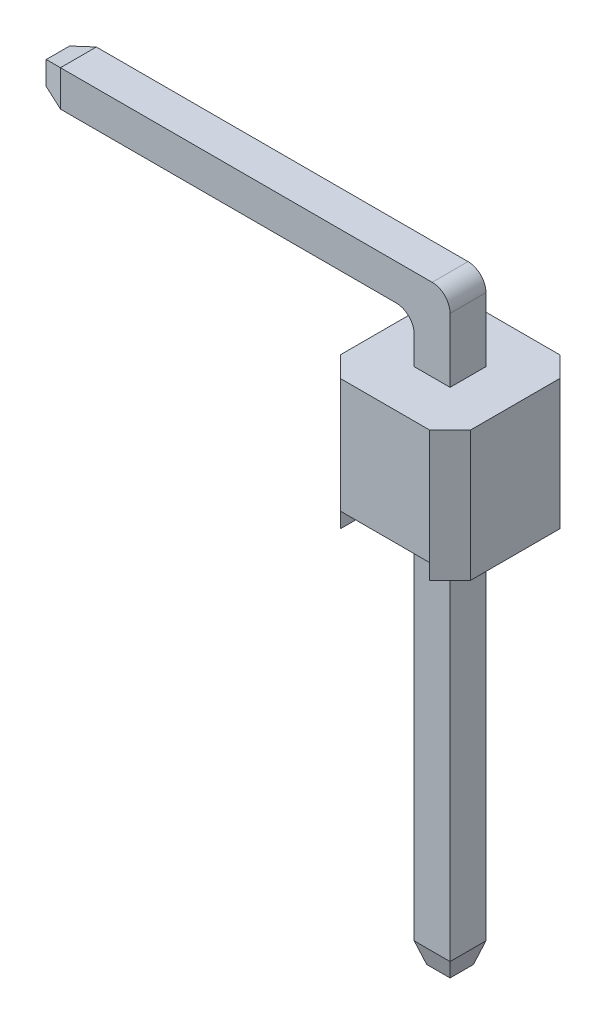
ISO-10303-21;
HEADER;
FILE_DESCRIPTION(('STEP AP214'),'2;1');
FILE_NAME('part.step','',(''),(''),'','','');
FILE_SCHEMA(('AUTOMOTIVE_DESIGN { 1 0 10303 214 1 1 1 1 }'));
ENDSEC;
DATA;
#1=APPLICATION_CONTEXT('core data for automotive mechanical design processes');
#2=APPLICATION_PROTOCOL_DEFINITION('international standard','automotive_design',2000,#1);
#3=PRODUCT_CONTEXT('',#1,'mechanical');
#4=PRODUCT('Part','Part','',(#3));
#5=PRODUCT_RELATED_PRODUCT_CATEGORY('part','',(#4));
#6=PRODUCT_DEFINITION_FORMATION('','',#4);
#7=PRODUCT_DEFINITION_CONTEXT('part definition',#1,'design');
#8=PRODUCT_DEFINITION('design','',#6,#7);
#9=PRODUCT_DEFINITION_SHAPE('','',#8);
#10=(LENGTH_UNIT() NAMED_UNIT(*) SI_UNIT(.MILLI.,.METRE.));
#11=(NAMED_UNIT(*) PLANE_ANGLE_UNIT() SI_UNIT($,.RADIAN.));
#12=(NAMED_UNIT(*) SI_UNIT($,.STERADIAN.) SOLID_ANGLE_UNIT());
#13=UNCERTAINTY_MEASURE_WITH_UNIT(LENGTH_MEASURE(1.E-05),#10,'distance_accuracy_value','');
#14=(GEOMETRIC_REPRESENTATION_CONTEXT(3) GLOBAL_UNCERTAINTY_ASSIGNED_CONTEXT((#13)) GLOBAL_UNIT_ASSIGNED_CONTEXT((#10,
#11,#12)) REPRESENTATION_CONTEXT('',''));
#15=CARTESIAN_POINT('',(0.,0.,0.));
#16=DIRECTION('',(0.,0.,1.));
#17=DIRECTION('',(1.,0.,0.));
#18=AXIS2_PLACEMENT_3D('',#15,#16,#17);
#19=CARTESIAN_POINT('',(0.,0.3,0.));
#20=DIRECTION('',(0.,-1.,0.));
#21=DIRECTION('',(0.,0.,-1.));
#22=AXIS2_PLACEMENT_3D('',#19,#20,#21);
#23=PLANE('',#22);
#24=DIRECTION('',(0.,0.,-1.));
#25=VECTOR('',#24,1.);
#26=CARTESIAN_POINT('',(-0.870000000000001,0.3,1.27));
#27=LINE('',#26,#25);
#28=CARTESIAN_POINT('',(-0.870000000000001,0.3,1.27));
#29=VERTEX_POINT('',#28);
#30=CARTESIAN_POINT('',(-0.870000000000001,0.3,-1.27));
#31=VERTEX_POINT('',#30);
#32=EDGE_CURVE('E275',#29,#31,#27,.T.);
#33=ORIENTED_EDGE('',*,*,#32,.T.);
#34=DIRECTION('',(1.,0.,0.));
#35=VECTOR('',#34,1.);
#36=CARTESIAN_POINT('',(-0.870000000000001,0.3,-1.27));
#37=LINE('',#36,#35);
#38=CARTESIAN_POINT('',(0.869999999999999,0.3,-1.27));
#39=VERTEX_POINT('',#38);
#40=EDGE_CURVE('E278',#31,#39,#37,.T.);
#41=ORIENTED_EDGE('',*,*,#40,.T.);
#42=DIRECTION('',(0.,0.,1.));
#43=VECTOR('',#42,1.);
#44=CARTESIAN_POINT('',(0.869999999999999,0.3,1.27));
#45=LINE('',#44,#43);
#46=CARTESIAN_POINT('',(0.869999999999999,0.3,1.27));
#47=VERTEX_POINT('',#46);
#48=EDGE_CURVE('E282',#39,#47,#45,.T.);
#49=ORIENTED_EDGE('',*,*,#48,.T.);
#50=DIRECTION('',(-1.,0.,0.));
#51=VECTOR('',#50,1.);
#52=CARTESIAN_POINT('',(-0.870000000000001,0.3,1.27));
#53=LINE('',#52,#51);
#54=EDGE_CURVE('E285',#47,#29,#53,.T.);
#55=ORIENTED_EDGE('',*,*,#54,.T.);
#56=EDGE_LOOP('',(#33,#41,#49,#55));
#57=FACE_BOUND('',#56,.T.);
#58=DIRECTION('',(1.,0.,0.));
#59=VECTOR('',#58,1.);
#60=CARTESIAN_POINT('',(0.35,0.3,-0.35));
#61=LINE('',#60,#59);
#62=CARTESIAN_POINT('',(-0.35,0.3,-0.35));
#63=VERTEX_POINT('',#62);
#64=CARTESIAN_POINT('',(0.35,0.3,-0.35));
#65=VERTEX_POINT('',#64);
#66=EDGE_CURVE('E233',#63,#65,#61,.T.);
#67=ORIENTED_EDGE('',*,*,#66,.F.);
#68=DIRECTION('',(0.,0.,-1.));
#69=VECTOR('',#68,1.);
#70=CARTESIAN_POINT('',(-0.35,0.3,0.35));
#71=LINE('',#70,#69);
#72=CARTESIAN_POINT('',(-0.35,0.3,0.35));
#73=VERTEX_POINT('',#72);
#74=EDGE_CURVE('E214',#73,#63,#71,.T.);
#75=ORIENTED_EDGE('',*,*,#74,.F.);
#76=DIRECTION('',(-1.,0.,0.));
#77=VECTOR('',#76,1.);
#78=CARTESIAN_POINT('',(0.35,0.3,0.35));
#79=LINE('',#78,#77);
#80=CARTESIAN_POINT('',(0.35,0.3,0.35));
#81=VERTEX_POINT('',#80);
#82=EDGE_CURVE('E223',#81,#73,#79,.T.);
#83=ORIENTED_EDGE('',*,*,#82,.F.);
#84=DIRECTION('',(0.,0.,1.));
#85=VECTOR('',#84,1.);
#86=CARTESIAN_POINT('',(0.35,0.3,0.35));
#87=LINE('',#86,#85);
#88=EDGE_CURVE('E242',#65,#81,#87,.T.);
#89=ORIENTED_EDGE('',*,*,#88,.F.);
#90=EDGE_LOOP('',(#67,#75,#83,#89));
#91=FACE_BOUND('',#90,.T.);
#92=ADVANCED_FACE('F37',(#57,#91),#23,.T.);
#93=CARTESIAN_POINT('',(-0.35,4.14,-0.35));
#94=DIRECTION('',(1.,0.,0.));
#95=DIRECTION('',(0.,0.,-1.));
#96=AXIS2_PLACEMENT_3D('',#93,#94,#95);
#97=PLANE('',#96);
#98=DIRECTION('',(0.,-1.,0.));
#99=VECTOR('',#98,1.);
#100=CARTESIAN_POINT('',(-0.35,4.14,0.35));
#101=LINE('',#100,#99);
#102=CARTESIAN_POINT('',(-0.35,3.09,0.35));
#103=VERTEX_POINT('',#102);
#104=CARTESIAN_POINT('',(-0.35,2.54,0.35));
#105=VERTEX_POINT('',#104);
#106=EDGE_CURVE('E272',#103,#105,#101,.T.);
#107=ORIENTED_EDGE('',*,*,#106,.F.);
#108=DIRECTION('',(0.,0.,1.));
#109=VECTOR('',#108,1.);
#110=CARTESIAN_POINT('',(-0.35,3.09,-0.35));
#111=LINE('',#110,#109);
#112=CARTESIAN_POINT('',(-0.35,3.09,-0.35));
#113=VERTEX_POINT('',#112);
#114=EDGE_CURVE('E410',#103,#113,#111,.F.);
#115=ORIENTED_EDGE('',*,*,#114,.T.);
#116=DIRECTION('',(0.,-1.,0.));
#117=VECTOR('',#116,1.);
#118=CARTESIAN_POINT('',(-0.35,4.14,-0.35));
#119=LINE('',#118,#117);
#120=CARTESIAN_POINT('',(-0.35,2.54,-0.35));
#121=VERTEX_POINT('',#120);
#122=EDGE_CURVE('E256',#113,#121,#119,.T.);
#123=ORIENTED_EDGE('',*,*,#122,.T.);
#124=DIRECTION('',(0.,0.,1.));
#125=VECTOR('',#124,1.);
#126=CARTESIAN_POINT('',(-0.35,2.54,-0.35));
#127=LINE('',#126,#125);
#128=EDGE_CURVE('E249',#121,#105,#127,.T.);
#129=ORIENTED_EDGE('',*,*,#128,.T.);
#130=EDGE_LOOP('',(#107,#115,#123,#129));
#131=FACE_BOUND('',#130,.T.);
#132=ADVANCED_FACE('F426',(#131),#97,.F.);
#133=CARTESIAN_POINT('',(0.,2.54,0.));
#134=DIRECTION('',(0.,1.,0.));
#135=DIRECTION('',(0.,0.,1.));
#136=AXIS2_PLACEMENT_3D('',#133,#134,#135);
#137=PLANE('',#136);
#138=DIRECTION('',(-1.,0.,0.));
#139=VECTOR('',#138,1.);
#140=CARTESIAN_POINT('',(-1.27,2.54,-1.27));
#141=LINE('',#140,#139);
#142=CARTESIAN_POINT('',(0.869999999999999,2.54,-1.27));
#143=VERTEX_POINT('',#142);
#144=CARTESIAN_POINT('',(-0.869999999999999,2.54,-1.27));
#145=VERTEX_POINT('',#144);
#146=EDGE_CURVE('E298',#143,#145,#141,.T.);
#147=ORIENTED_EDGE('',*,*,#146,.T.);
#148=DIRECTION('',(0.707106781186548,0.,-0.707106781186547));
#149=VECTOR('',#148,1.);
#150=CARTESIAN_POINT('',(-1.07,2.54,-1.07));
#151=LINE('',#150,#149);
#152=CARTESIAN_POINT('',(-1.27,2.54,-0.869999999999999));
#153=VERTEX_POINT('',#152);
#154=EDGE_CURVE('E339',#145,#153,#151,.F.);
#155=ORIENTED_EDGE('',*,*,#154,.T.);
#156=DIRECTION('',(0.,0.,1.));
#157=VECTOR('',#156,1.);
#158=CARTESIAN_POINT('',(-1.27,2.54,-1.27));
#159=LINE('',#158,#157);
#160=CARTESIAN_POINT('',(-1.27,2.54,0.869999999999999));
#161=VERTEX_POINT('',#160);
#162=EDGE_CURVE('E302',#153,#161,#159,.T.);
#163=ORIENTED_EDGE('',*,*,#162,.T.);
#164=DIRECTION('',(-0.707106781186546,0.,-0.707106781186549));
#165=VECTOR('',#164,1.);
#166=CARTESIAN_POINT('',(-1.07,2.54,1.07));
#167=LINE('',#166,#165);
#168=CARTESIAN_POINT('',(-0.87,2.54,1.27));
#169=VERTEX_POINT('',#168);
#170=EDGE_CURVE('E335',#161,#169,#167,.F.);
#171=ORIENTED_EDGE('',*,*,#170,.T.);
#172=DIRECTION('',(1.,0.,0.));
#173=VECTOR('',#172,1.);
#174=CARTESIAN_POINT('',(-1.27,2.54,1.27));
#175=LINE('',#174,#173);
#176=CARTESIAN_POINT('',(0.869999999999998,2.54,1.27));
#177=VERTEX_POINT('',#176);
#178=EDGE_CURVE('E305',#169,#177,#175,.T.);
#179=ORIENTED_EDGE('',*,*,#178,.T.);
#180=DIRECTION('',(-0.707106781186549,0.,0.707106781186546));
#181=VECTOR('',#180,1.);
#182=CARTESIAN_POINT('',(1.07,2.54,1.07));
#183=LINE('',#182,#181);
#184=CARTESIAN_POINT('',(1.27,2.54,0.869999999999999));
#185=VERTEX_POINT('',#184);
#186=EDGE_CURVE('E333',#177,#185,#183,.F.);
#187=ORIENTED_EDGE('',*,*,#186,.T.);
#188=DIRECTION('',(0.,0.,-1.));
#189=VECTOR('',#188,1.);
#190=CARTESIAN_POINT('',(1.27,2.54,-1.27));
#191=LINE('',#190,#189);
#192=CARTESIAN_POINT('',(1.27,2.54,-0.869999999999999));
#193=VERTEX_POINT('',#192);
#194=EDGE_CURVE('E295',#185,#193,#191,.T.);
#195=ORIENTED_EDGE('',*,*,#194,.T.);
#196=DIRECTION('',(0.707106781186547,0.,0.707106781186548));
#197=VECTOR('',#196,1.);
#198=CARTESIAN_POINT('',(1.07,2.54,-1.07));
#199=LINE('',#198,#197);
#200=EDGE_CURVE('E337',#193,#143,#199,.F.);
#201=ORIENTED_EDGE('',*,*,#200,.T.);
#202=EDGE_LOOP('',(#147,#155,#163,#171,#179,#187,#195,#201));
#203=FACE_BOUND('',#202,.T.);
#204=DIRECTION('',(1.,0.,0.));
#205=VECTOR('',#204,1.);
#206=CARTESIAN_POINT('',(0.35,2.54,0.35));
#207=LINE('',#206,#205);
#208=CARTESIAN_POINT('',(0.35,2.54,0.35));
#209=VERTEX_POINT('',#208);
#210=EDGE_CURVE('E259',#105,#209,#207,.T.);
#211=ORIENTED_EDGE('',*,*,#210,.F.);
#212=ORIENTED_EDGE('',*,*,#128,.F.);
#213=DIRECTION('',(-1.,0.,0.));
#214=VECTOR('',#213,1.);
#215=CARTESIAN_POINT('',(0.35,2.54,-0.35));
#216=LINE('',#215,#214);
#217=CARTESIAN_POINT('',(0.35,2.54,-0.35));
#218=VERTEX_POINT('',#217);
#219=EDGE_CURVE('E254',#218,#121,#216,.T.);
#220=ORIENTED_EDGE('',*,*,#219,.F.);
#221=DIRECTION('',(0.,0.,-1.));
#222=VECTOR('',#221,1.);
#223=CARTESIAN_POINT('',(0.35,2.54,-0.35));
#224=LINE('',#223,#222);
#225=EDGE_CURVE('E262',#209,#218,#224,.T.);
#226=ORIENTED_EDGE('',*,*,#225,.F.);
#227=EDGE_LOOP('',(#211,#212,#220,#226));
#228=FACE_BOUND('',#227,.T.);
#229=ADVANCED_FACE('F475',(#203,#228),#137,.T.);
#230=CARTESIAN_POINT('',(-1.27,2.54,-1.27));
#231=DIRECTION('',(0.,0.,1.));
#232=DIRECTION('',(1.,0.,0.));
#233=AXIS2_PLACEMENT_3D('',#230,#231,#232);
#234=PLANE('',#233);
#235=ORIENTED_EDGE('',*,*,#40,.F.);
#236=DIRECTION('',(0.,1.,0.));
#237=VECTOR('',#236,1.);
#238=CARTESIAN_POINT('',(-0.869999999999999,2.54,-1.27));
#239=LINE('',#238,#237);
#240=EDGE_CURVE('E330',#31,#145,#239,.T.);
#241=ORIENTED_EDGE('',*,*,#240,.T.);
#242=ORIENTED_EDGE('',*,*,#146,.F.);
#243=DIRECTION('',(0.,-1.,0.));
#244=VECTOR('',#243,1.);
#245=CARTESIAN_POINT('',(0.869999999999999,2.54,-1.27));
#246=LINE('',#245,#244);
#247=EDGE_CURVE('E327',#143,#39,#246,.T.);
#248=ORIENTED_EDGE('',*,*,#247,.T.);
#249=EDGE_LOOP('',(#235,#241,#242,#248));
#250=FACE_BOUND('',#249,.T.);
#251=ADVANCED_FACE('F490',(#250),#234,.F.);
#252=CARTESIAN_POINT('',(-1.27,2.54,1.27));
#253=DIRECTION('',(0.,0.,-1.));
#254=DIRECTION('',(-1.,0.,0.));
#255=AXIS2_PLACEMENT_3D('',#252,#253,#254);
#256=PLANE('',#255);
#257=ORIENTED_EDGE('',*,*,#54,.F.);
#258=DIRECTION('',(0.,1.,0.));
#259=VECTOR('',#258,1.);
#260=CARTESIAN_POINT('',(0.869999999999999,2.54,1.27));
#261=LINE('',#260,#259);
#262=EDGE_CURVE('E346',#47,#177,#261,.T.);
#263=ORIENTED_EDGE('',*,*,#262,.T.);
#264=ORIENTED_EDGE('',*,*,#178,.F.);
#265=DIRECTION('',(0.,-1.,0.));
#266=VECTOR('',#265,1.);
#267=CARTESIAN_POINT('',(-0.87,2.54,1.27));
#268=LINE('',#267,#266);
#269=EDGE_CURVE('E349',#169,#29,#268,.T.);
#270=ORIENTED_EDGE('',*,*,#269,.T.);
#271=EDGE_LOOP('',(#257,#263,#264,#270));
#272=FACE_BOUND('',#271,.T.);
#273=ADVANCED_FACE('F499',(#272),#256,.F.);
#274=CARTESIAN_POINT('',(0.,0.,0.));
#275=DIRECTION('',(0.,1.,0.));
#276=DIRECTION('',(0.,0.,1.));
#277=AXIS2_PLACEMENT_3D('',#274,#275,#276);
#278=PLANE('',#277);
#279=DIRECTION('',(-0.707106781186548,0.,0.707106781186547));
#280=VECTOR('',#279,1.);
#281=CARTESIAN_POINT('',(-1.27,0.,-0.869999999999999));
#282=LINE('',#281,#280);
#283=CARTESIAN_POINT('',(-1.27,0.,-0.869999999999999));
#284=VERTEX_POINT('',#283);
#285=CARTESIAN_POINT('',(-0.870000000000001,0.,-1.27));
#286=VERTEX_POINT('',#285);
#287=EDGE_CURVE('E324',#284,#286,#282,.F.);
#288=ORIENTED_EDGE('',*,*,#287,.T.);
#289=DIRECTION('',(0.,0.,-1.));
#290=VECTOR('',#289,1.);
#291=CARTESIAN_POINT('',(-0.870000000000001,0.,1.27));
#292=LINE('',#291,#290);
#293=CARTESIAN_POINT('',(-0.870000000000001,0.,1.27));
#294=VERTEX_POINT('',#293);
#295=EDGE_CURVE('E274',#294,#286,#292,.T.);
#296=ORIENTED_EDGE('',*,*,#295,.F.);
#297=DIRECTION('',(0.707106781186546,0.,0.707106781186549));
#298=VECTOR('',#297,1.);
#299=CARTESIAN_POINT('',(-0.87,0.,1.27));
#300=LINE('',#299,#298);
#301=CARTESIAN_POINT('',(-1.27,0.,0.869999999999999));
#302=VERTEX_POINT('',#301);
#303=EDGE_CURVE('E320',#294,#302,#300,.F.);
#304=ORIENTED_EDGE('',*,*,#303,.T.);
#305=DIRECTION('',(0.,0.,1.));
#306=VECTOR('',#305,1.);
#307=CARTESIAN_POINT('',(-1.27,0.,-1.27));
#308=LINE('',#307,#306);
#309=EDGE_CURVE('E299',#284,#302,#308,.T.);
#310=ORIENTED_EDGE('',*,*,#309,.F.);
#311=EDGE_LOOP('',(#288,#296,#304,#310));
#312=FACE_BOUND('',#311,.T.);
#313=ADVANCED_FACE('F498',(#312),#278,.F.);
#314=CARTESIAN_POINT('',(1.27,2.54,-1.27));
#315=DIRECTION('',(-1.,0.,0.));
#316=DIRECTION('',(0.,0.,1.));
#317=AXIS2_PLACEMENT_3D('',#314,#315,#316);
#318=PLANE('',#317);
#319=DIRECTION('',(0.,0.,-1.));
#320=VECTOR('',#319,1.);
#321=CARTESIAN_POINT('',(1.27,0.,-1.27));
#322=LINE('',#321,#320);
#323=CARTESIAN_POINT('',(1.27,0.,0.87));
#324=VERTEX_POINT('',#323);
#325=CARTESIAN_POINT('',(1.27,0.,-0.869999999999998));
#326=VERTEX_POINT('',#325);
#327=EDGE_CURVE('E293',#324,#326,#322,.T.);
#328=ORIENTED_EDGE('',*,*,#327,.T.);
#329=DIRECTION('',(0.,1.,0.));
#330=VECTOR('',#329,1.);
#331=CARTESIAN_POINT('',(1.27,2.54,-0.869999999999998));
#332=LINE('',#331,#330);
#333=EDGE_CURVE('E344',#326,#193,#332,.T.);
#334=ORIENTED_EDGE('',*,*,#333,.T.);
#335=ORIENTED_EDGE('',*,*,#194,.F.);
#336=DIRECTION('',(0.,-1.,0.));
#337=VECTOR('',#336,1.);
#338=CARTESIAN_POINT('',(1.27,2.54,0.870000000000001));
#339=LINE('',#338,#337);
#340=EDGE_CURVE('E341',#185,#324,#339,.T.);
#341=ORIENTED_EDGE('',*,*,#340,.T.);
#342=EDGE_LOOP('',(#328,#334,#335,#341));
#343=FACE_BOUND('',#342,.T.);
#344=ADVANCED_FACE('F505',(#343),#318,.F.);
#345=CARTESIAN_POINT('',(-1.27,2.54,-1.27));
#346=DIRECTION('',(1.,0.,0.));
#347=DIRECTION('',(0.,0.,-1.));
#348=AXIS2_PLACEMENT_3D('',#345,#346,#347);
#349=PLANE('',#348);
#350=ORIENTED_EDGE('',*,*,#162,.F.);
#351=DIRECTION('',(0.,-1.,0.));
#352=VECTOR('',#351,1.);
#353=CARTESIAN_POINT('',(-1.27,2.54,-0.869999999999999));
#354=LINE('',#353,#352);
#355=EDGE_CURVE('E314',#153,#284,#354,.T.);
#356=ORIENTED_EDGE('',*,*,#355,.T.);
#357=ORIENTED_EDGE('',*,*,#309,.T.);
#358=DIRECTION('',(0.,1.,0.));
#359=VECTOR('',#358,1.);
#360=CARTESIAN_POINT('',(-1.27,2.54,0.869999999999999));
#361=LINE('',#360,#359);
#362=EDGE_CURVE('E308',#302,#161,#361,.T.);
#363=ORIENTED_EDGE('',*,*,#362,.T.);
#364=EDGE_LOOP('',(#350,#356,#357,#363));
#365=FACE_BOUND('',#364,.T.);
#366=ADVANCED_FACE('F496',(#365),#349,.F.);
#367=DIRECTION('',(0.707106781186549,0.,-0.707106781186546));
#368=VECTOR('',#367,1.);
#369=CARTESIAN_POINT('',(1.27,0.,0.870000000000001));
#370=LINE('',#369,#368);
#371=CARTESIAN_POINT('',(0.869999999999999,0.,1.27));
#372=VERTEX_POINT('',#371);
#373=EDGE_CURVE('E317',#324,#372,#370,.F.);
#374=ORIENTED_EDGE('',*,*,#373,.T.);
#375=DIRECTION('',(0.,0.,1.));
#376=VECTOR('',#375,1.);
#377=CARTESIAN_POINT('',(0.869999999999999,0.,1.27));
#378=LINE('',#377,#376);
#379=CARTESIAN_POINT('',(0.869999999999999,0.,-1.27));
#380=VERTEX_POINT('',#379);
#381=EDGE_CURVE('E279',#380,#372,#378,.T.);
#382=ORIENTED_EDGE('',*,*,#381,.F.);
#383=DIRECTION('',(-0.707106781186547,0.,-0.707106781186548));
#384=VECTOR('',#383,1.);
#385=CARTESIAN_POINT('',(0.869999999999999,0.,-1.27));
#386=LINE('',#385,#384);
#387=EDGE_CURVE('E322',#380,#326,#386,.F.);
#388=ORIENTED_EDGE('',*,*,#387,.T.);
#389=ORIENTED_EDGE('',*,*,#327,.F.);
#390=EDGE_LOOP('',(#374,#382,#388,#389));
#391=FACE_BOUND('',#390,.T.);
#392=ADVANCED_FACE('F492',(#391),#278,.F.);
#393=CARTESIAN_POINT('',(-1.27,2.54,-0.869999999999999));
#394=DIRECTION('',(0.707106781186547,0.,0.707106781186548));
#395=DIRECTION('',(0.,-1.,0.));
#396=AXIS2_PLACEMENT_3D('',#393,#394,#395);
#397=PLANE('',#396);
#398=ORIENTED_EDGE('',*,*,#154,.F.);
#399=ORIENTED_EDGE('',*,*,#240,.F.);
#400=EDGE_CURVE('E331',#286,#31,#239,.T.);
#401=ORIENTED_EDGE('',*,*,#400,.F.);
#402=ORIENTED_EDGE('',*,*,#287,.F.);
#403=ORIENTED_EDGE('',*,*,#355,.F.);
#404=EDGE_LOOP('',(#398,#399,#401,#402,#403));
#405=FACE_BOUND('',#404,.T.);
#406=ADVANCED_FACE('F495',(#405),#397,.F.);
#407=CARTESIAN_POINT('',(0.869999999999999,2.54,-1.27));
#408=DIRECTION('',(-0.707106781186548,0.,0.707106781186547));
#409=DIRECTION('',(0.,-1.,0.));
#410=AXIS2_PLACEMENT_3D('',#407,#408,#409);
#411=PLANE('',#410);
#412=ORIENTED_EDGE('',*,*,#200,.F.);
#413=ORIENTED_EDGE('',*,*,#333,.F.);
#414=ORIENTED_EDGE('',*,*,#387,.F.);
#415=DIRECTION('',(0.,-1.,0.));
#416=VECTOR('',#415,1.);
#417=CARTESIAN_POINT('',(0.869999999999999,0.3,-1.27));
#418=LINE('',#417,#416);
#419=EDGE_CURVE('E288',#39,#380,#418,.T.);
#420=ORIENTED_EDGE('',*,*,#419,.F.);
#421=ORIENTED_EDGE('',*,*,#247,.F.);
#422=EDGE_LOOP('',(#412,#413,#414,#420,#421));
#423=FACE_BOUND('',#422,.T.);
#424=ADVANCED_FACE('F515',(#423),#411,.F.);
#425=CARTESIAN_POINT('',(-0.87,2.54,1.27));
#426=DIRECTION('',(0.707106781186549,0.,-0.707106781186546));
#427=DIRECTION('',(0.,-1.,0.));
#428=AXIS2_PLACEMENT_3D('',#425,#426,#427);
#429=PLANE('',#428);
#430=ORIENTED_EDGE('',*,*,#170,.F.);
#431=ORIENTED_EDGE('',*,*,#362,.F.);
#432=ORIENTED_EDGE('',*,*,#303,.F.);
#433=DIRECTION('',(0.,-1.,0.));
#434=VECTOR('',#433,1.);
#435=CARTESIAN_POINT('',(-0.870000000000001,0.3,1.27));
#436=LINE('',#435,#434);
#437=EDGE_CURVE('E291',#29,#294,#436,.T.);
#438=ORIENTED_EDGE('',*,*,#437,.F.);
#439=ORIENTED_EDGE('',*,*,#269,.F.);
#440=EDGE_LOOP('',(#430,#431,#432,#438,#439));
#441=FACE_BOUND('',#440,.T.);
#442=ADVANCED_FACE('F519',(#441),#429,.F.);
#443=CARTESIAN_POINT('',(1.27,2.54,0.870000000000001));
#444=DIRECTION('',(-0.707106781186546,0.,-0.707106781186549));
#445=DIRECTION('',(0.,-1.,0.));
#446=AXIS2_PLACEMENT_3D('',#443,#444,#445);
#447=PLANE('',#446);
#448=ORIENTED_EDGE('',*,*,#186,.F.);
#449=ORIENTED_EDGE('',*,*,#262,.F.);
#450=EDGE_CURVE('E347',#372,#47,#261,.T.);
#451=ORIENTED_EDGE('',*,*,#450,.F.);
#452=ORIENTED_EDGE('',*,*,#373,.F.);
#453=ORIENTED_EDGE('',*,*,#340,.F.);
#454=EDGE_LOOP('',(#448,#449,#451,#452,#453));
#455=FACE_BOUND('',#454,.T.);
#456=ADVANCED_FACE('F486',(#455),#447,.F.);
#457=CARTESIAN_POINT('',(-0.870000000000001,0.3,1.27));
#458=DIRECTION('',(-1.,0.,0.));
#459=DIRECTION('',(0.,0.,1.));
#460=AXIS2_PLACEMENT_3D('',#457,#458,#459);
#461=PLANE('',#460);
#462=ORIENTED_EDGE('',*,*,#295,.T.);
#463=ORIENTED_EDGE('',*,*,#400,.T.);
#464=ORIENTED_EDGE('',*,*,#32,.F.);
#465=ORIENTED_EDGE('',*,*,#437,.T.);
#466=EDGE_LOOP('',(#462,#463,#464,#465));
#467=FACE_BOUND('',#466,.T.);
#468=ADVANCED_FACE('F482',(#467),#461,.F.);
#469=CARTESIAN_POINT('',(0.869999999999999,0.3,1.27));
#470=DIRECTION('',(1.,0.,0.));
#471=DIRECTION('',(0.,0.,-1.));
#472=AXIS2_PLACEMENT_3D('',#469,#470,#471);
#473=PLANE('',#472);
#474=ORIENTED_EDGE('',*,*,#381,.T.);
#475=ORIENTED_EDGE('',*,*,#450,.T.);
#476=ORIENTED_EDGE('',*,*,#48,.F.);
#477=ORIENTED_EDGE('',*,*,#419,.T.);
#478=EDGE_LOOP('',(#474,#475,#476,#477));
#479=FACE_BOUND('',#478,.T.);
#480=ADVANCED_FACE('F479',(#479),#473,.F.);
#481=CARTESIAN_POINT('',(0.35,4.14,0.35));
#482=DIRECTION('',(0.,0.,-1.));
#483=DIRECTION('',(-1.,0.,0.));
#484=AXIS2_PLACEMENT_3D('',#481,#482,#483);
#485=PLANE('',#484);
#486=DIRECTION('',(0.,-1.,0.));
#487=VECTOR('',#486,1.);
#488=CARTESIAN_POINT('',(0.35,4.14,0.35));
#489=LINE('',#488,#487);
#490=CARTESIAN_POINT('',(0.35,3.79,0.35));
#491=VERTEX_POINT('',#490);
#492=EDGE_CURVE('E270',#491,#209,#489,.T.);
#493=ORIENTED_EDGE('',*,*,#492,.F.);
#494=CARTESIAN_POINT('',(0.,3.79,0.35));
#495=DIRECTION('',(0.,0.,-1.));
#496=DIRECTION('',(-1.,0.,0.));
#497=AXIS2_PLACEMENT_3D('',#494,#495,#496);
#498=CIRCLE('',#497,0.35);
#499=CARTESIAN_POINT('',(0.,4.14,0.35));
#500=VERTEX_POINT('',#499);
#501=EDGE_CURVE('E417',#491,#500,#498,.F.);
#502=ORIENTED_EDGE('',*,*,#501,.T.);
#503=DIRECTION('',(1.,0.,0.));
#504=VECTOR('',#503,1.);
#505=CARTESIAN_POINT('',(0.35,4.14,0.35));
#506=LINE('',#505,#504);
#507=CARTESIAN_POINT('',(-7.24999999999999,4.14,0.350000000000002));
#508=VERTEX_POINT('',#507);
#509=EDGE_CURVE('E250',#508,#500,#506,.T.);
#510=ORIENTED_EDGE('',*,*,#509,.F.);
#511=DIRECTION('',(0.,-1.,0.));
#512=VECTOR('',#511,1.);
#513=CARTESIAN_POINT('',(-7.24999999999999,3.44,0.350000000000002));
#514=LINE('',#513,#512);
#515=CARTESIAN_POINT('',(-7.24999999999999,3.44,0.350000000000001));
#516=VERTEX_POINT('',#515);
#517=EDGE_CURVE('E364',#508,#516,#514,.T.);
#518=ORIENTED_EDGE('',*,*,#517,.T.);
#519=DIRECTION('',(1.,0.,0.));
#520=VECTOR('',#519,1.);
#521=CARTESIAN_POINT('',(-7.65,3.44,0.350000000000001));
#522=LINE('',#521,#520);
#523=CARTESIAN_POINT('',(-0.7,3.44,0.35));
#524=VERTEX_POINT('',#523);
#525=EDGE_CURVE('E230',#516,#524,#522,.T.);
#526=ORIENTED_EDGE('',*,*,#525,.T.);
#527=CARTESIAN_POINT('',(-0.7,3.09,0.35));
#528=DIRECTION('',(0.,0.,-1.));
#529=DIRECTION('',(-1.,0.,0.));
#530=AXIS2_PLACEMENT_3D('',#527,#528,#529);
#531=CIRCLE('',#530,0.35);
#532=EDGE_CURVE('E45',#524,#103,#531,.T.);
#533=ORIENTED_EDGE('',*,*,#532,.T.);
#534=ORIENTED_EDGE('',*,*,#106,.T.);
#535=ORIENTED_EDGE('',*,*,#210,.T.);
#536=EDGE_LOOP('',(#493,#502,#510,#518,#526,#533,#534,#535));
#537=FACE_BOUND('',#536,.T.);
#538=ADVANCED_FACE('F420',(#537),#485,.F.);
#539=CARTESIAN_POINT('',(0.35,4.14,-0.35));
#540=DIRECTION('',(-1.,0.,0.));
#541=DIRECTION('',(0.,0.,1.));
#542=AXIS2_PLACEMENT_3D('',#539,#540,#541);
#543=PLANE('',#542);
#544=DIRECTION('',(0.,-1.,0.));
#545=VECTOR('',#544,1.);
#546=CARTESIAN_POINT('',(0.35,4.14,-0.35));
#547=LINE('',#546,#545);
#548=CARTESIAN_POINT('',(0.35,3.79,-0.35));
#549=VERTEX_POINT('',#548);
#550=EDGE_CURVE('E268',#549,#218,#547,.T.);
#551=ORIENTED_EDGE('',*,*,#550,.F.);
#552=DIRECTION('',(0.,0.,-1.));
#553=VECTOR('',#552,1.);
#554=CARTESIAN_POINT('',(0.35,3.79,-0.35));
#555=LINE('',#554,#553);
#556=EDGE_CURVE('E52',#549,#491,#555,.F.);
#557=ORIENTED_EDGE('',*,*,#556,.T.);
#558=ORIENTED_EDGE('',*,*,#492,.T.);
#559=ORIENTED_EDGE('',*,*,#225,.T.);
#560=EDGE_LOOP('',(#551,#557,#558,#559));
#561=FACE_BOUND('',#560,.T.);
#562=ADVANCED_FACE('F588',(#561),#543,.F.);
#563=CARTESIAN_POINT('',(0.35,4.14,-0.35));
#564=DIRECTION('',(0.,0.,1.));
#565=DIRECTION('',(1.,0.,0.));
#566=AXIS2_PLACEMENT_3D('',#563,#564,#565);
#567=PLANE('',#566);
#568=DIRECTION('',(-1.,0.,0.));
#569=VECTOR('',#568,1.);
#570=CARTESIAN_POINT('',(0.35,4.14,-0.35));
#571=LINE('',#570,#569);
#572=CARTESIAN_POINT('',(0.,4.14,-0.35));
#573=VERTEX_POINT('',#572);
#574=CARTESIAN_POINT('',(-7.24999999999999,4.14,-0.35));
#575=VERTEX_POINT('',#574);
#576=EDGE_CURVE('E253',#573,#575,#571,.T.);
#577=ORIENTED_EDGE('',*,*,#576,.F.);
#578=CARTESIAN_POINT('',(0.,3.79,-0.35));
#579=DIRECTION('',(0.,0.,1.));
#580=DIRECTION('',(1.,0.,0.));
#581=AXIS2_PLACEMENT_3D('',#578,#579,#580);
#582=CIRCLE('',#581,0.35);
#583=EDGE_CURVE('E60',#573,#549,#582,.F.);
#584=ORIENTED_EDGE('',*,*,#583,.T.);
#585=ORIENTED_EDGE('',*,*,#550,.T.);
#586=ORIENTED_EDGE('',*,*,#219,.T.);
#587=ORIENTED_EDGE('',*,*,#122,.F.);
#588=CARTESIAN_POINT('',(-0.7,3.09,-0.35));
#589=DIRECTION('',(0.,0.,1.));
#590=DIRECTION('',(1.,0.,0.));
#591=AXIS2_PLACEMENT_3D('',#588,#589,#590);
#592=CIRCLE('',#591,0.35);
#593=CARTESIAN_POINT('',(-0.7,3.44,-0.35));
#594=VERTEX_POINT('',#593);
#595=EDGE_CURVE('E12',#113,#594,#592,.T.);
#596=ORIENTED_EDGE('',*,*,#595,.T.);
#597=DIRECTION('',(1.,0.,0.));
#598=VECTOR('',#597,1.);
#599=CARTESIAN_POINT('',(-7.65,3.44,-0.349999999999999));
#600=LINE('',#599,#598);
#601=CARTESIAN_POINT('',(-7.24999999999999,3.44,-0.349999999999999));
#602=VERTEX_POINT('',#601);
#603=EDGE_CURVE('E246',#602,#594,#600,.T.);
#604=ORIENTED_EDGE('',*,*,#603,.F.);
#605=DIRECTION('',(0.,1.,0.));
#606=VECTOR('',#605,1.);
#607=CARTESIAN_POINT('',(-7.24999999999999,4.14,-0.35));
#608=LINE('',#607,#606);
#609=EDGE_CURVE('E368',#602,#575,#608,.T.);
#610=ORIENTED_EDGE('',*,*,#609,.T.);
#611=EDGE_LOOP('',(#577,#584,#585,#586,#587,#596,#604,#610));
#612=FACE_BOUND('',#611,.T.);
#613=ADVANCED_FACE('F433',(#612),#567,.F.);
#614=CARTESIAN_POINT('',(0.,4.14,0.));
#615=DIRECTION('',(0.,-1.,0.));
#616=DIRECTION('',(0.,0.,-1.));
#617=AXIS2_PLACEMENT_3D('',#614,#615,#616);
#618=PLANE('',#617);
#619=ORIENTED_EDGE('',*,*,#509,.T.);
#620=DIRECTION('',(0.,0.,-1.));
#621=VECTOR('',#620,1.);
#622=CARTESIAN_POINT('',(0.,4.14,0.));
#623=LINE('',#622,#621);
#624=EDGE_CURVE('E412',#500,#573,#623,.T.);
#625=ORIENTED_EDGE('',*,*,#624,.T.);
#626=ORIENTED_EDGE('',*,*,#576,.T.);
#627=DIRECTION('',(0.,0.,1.));
#628=VECTOR('',#627,1.);
#629=CARTESIAN_POINT('',(-7.24999999999999,4.14,0.350000000000001));
#630=LINE('',#629,#628);
#631=EDGE_CURVE('E361',#575,#508,#630,.T.);
#632=ORIENTED_EDGE('',*,*,#631,.T.);
#633=EDGE_LOOP('',(#619,#625,#626,#632));
#634=FACE_BOUND('',#633,.T.);
#635=ADVANCED_FACE('F460',(#634),#618,.F.);
#636=CARTESIAN_POINT('',(-7.65,3.44,-0.349999999999999));
#637=DIRECTION('',(0.,1.,0.));
#638=DIRECTION('',(0.,0.,1.));
#639=AXIS2_PLACEMENT_3D('',#636,#637,#638);
#640=PLANE('',#639);
#641=ORIENTED_EDGE('',*,*,#603,.T.);
#642=DIRECTION('',(0.,0.,1.));
#643=VECTOR('',#642,1.);
#644=CARTESIAN_POINT('',(-0.7,3.44,0.35));
#645=LINE('',#644,#643);
#646=EDGE_CURVE('E388',#594,#524,#645,.T.);
#647=ORIENTED_EDGE('',*,*,#646,.T.);
#648=ORIENTED_EDGE('',*,*,#525,.F.);
#649=DIRECTION('',(0.,0.,-1.));
#650=VECTOR('',#649,1.);
#651=CARTESIAN_POINT('',(-7.24999999999999,3.44,-0.349999999999999));
#652=LINE('',#651,#650);
#653=EDGE_CURVE('E366',#516,#602,#652,.T.);
#654=ORIENTED_EDGE('',*,*,#653,.T.);
#655=EDGE_LOOP('',(#641,#647,#648,#654));
#656=FACE_BOUND('',#655,.T.);
#657=ADVANCED_FACE('F436',(#656),#640,.F.);
#658=CARTESIAN_POINT('',(-7.65,0.,0.));
#659=DIRECTION('',(-1.,0.,0.));
#660=DIRECTION('',(0.,0.,1.));
#661=AXIS2_PLACEMENT_3D('',#658,#659,#660);
#662=PLANE('',#661);
#663=DIRECTION('',(0.,1.,0.));
#664=VECTOR('',#663,1.);
#665=CARTESIAN_POINT('',(-7.65,4.14,0.227707727416537));
#666=LINE('',#665,#664);
#667=CARTESIAN_POINT('',(-7.65,3.56229227258346,0.227707727416537));
#668=VERTEX_POINT('',#667);
#669=CARTESIAN_POINT('',(-7.65,4.01770772741654,0.227707727416537));
#670=VERTEX_POINT('',#669);
#671=EDGE_CURVE('E356',#668,#670,#666,.T.);
#672=ORIENTED_EDGE('',*,*,#671,.T.);
#673=DIRECTION('',(0.,0.,-1.));
#674=VECTOR('',#673,1.);
#675=CARTESIAN_POINT('',(-7.65,4.01770772741654,-0.349999999999999));
#676=LINE('',#675,#674);
#677=CARTESIAN_POINT('',(-7.65,4.01770772741654,-0.227707727416535));
#678=VERTEX_POINT('',#677);
#679=EDGE_CURVE('E358',#670,#678,#676,.T.);
#680=ORIENTED_EDGE('',*,*,#679,.T.);
#681=DIRECTION('',(0.,-1.,0.));
#682=VECTOR('',#681,1.);
#683=CARTESIAN_POINT('',(-7.65,3.44,-0.227707727416535));
#684=LINE('',#683,#682);
#685=CARTESIAN_POINT('',(-7.65,3.56229227258346,-0.227707727416535));
#686=VERTEX_POINT('',#685);
#687=EDGE_CURVE('E352',#678,#686,#684,.T.);
#688=ORIENTED_EDGE('',*,*,#687,.T.);
#689=DIRECTION('',(0.,0.,1.));
#690=VECTOR('',#689,1.);
#691=CARTESIAN_POINT('',(-7.65,3.56229227258346,0.350000000000001));
#692=LINE('',#691,#690);
#693=EDGE_CURVE('E354',#686,#668,#692,.T.);
#694=ORIENTED_EDGE('',*,*,#693,.T.);
#695=EDGE_LOOP('',(#672,#680,#688,#694));
#696=FACE_BOUND('',#695,.T.);
#697=ADVANCED_FACE('F450',(#696),#662,.T.);
#698=CARTESIAN_POINT('',(-0.35,-20.2499494936612,0.35));
#699=DIRECTION('',(1.,0.,0.));
#700=DIRECTION('',(0.,0.,-1.));
#701=AXIS2_PLACEMENT_3D('',#698,#699,#700);
#702=PLANE('',#701);
#703=DIRECTION('',(0.,1.,0.));
#704=VECTOR('',#703,1.);
#705=CARTESIAN_POINT('',(-0.35,-20.2499494936612,-0.35));
#706=LINE('',#705,#704);
#707=CARTESIAN_POINT('',(-0.35,-7.16,-0.35));
#708=VERTEX_POINT('',#707);
#709=EDGE_CURVE('E234',#708,#63,#706,.T.);
#710=ORIENTED_EDGE('',*,*,#709,.F.);
#711=DIRECTION('',(0.,0.,1.));
#712=VECTOR('',#711,1.);
#713=CARTESIAN_POINT('',(-0.35,-7.16,0.35));
#714=LINE('',#713,#712);
#715=CARTESIAN_POINT('',(-0.35,-7.16,0.35));
#716=VERTEX_POINT('',#715);
#717=EDGE_CURVE('E217',#708,#716,#714,.T.);
#718=ORIENTED_EDGE('',*,*,#717,.T.);
#719=DIRECTION('',(0.,1.,0.));
#720=VECTOR('',#719,1.);
#721=CARTESIAN_POINT('',(-0.35,-20.2499494936612,0.35));
#722=LINE('',#721,#720);
#723=EDGE_CURVE('E209',#716,#73,#722,.T.);
#724=ORIENTED_EDGE('',*,*,#723,.T.);
#725=ORIENTED_EDGE('',*,*,#74,.T.);
#726=EDGE_LOOP('',(#710,#718,#724,#725));
#727=FACE_BOUND('',#726,.T.);
#728=ADVANCED_FACE('F212',(#727),#702,.F.);
#729=CARTESIAN_POINT('',(0.35,-20.2499494936612,-0.35));
#730=DIRECTION('',(0.,0.,1.));
#731=DIRECTION('',(1.,0.,0.));
#732=AXIS2_PLACEMENT_3D('',#729,#730,#731);
#733=PLANE('',#732);
#734=DIRECTION('',(0.,1.,0.));
#735=VECTOR('',#734,1.);
#736=CARTESIAN_POINT('',(0.35,-20.2499494936612,-0.35));
#737=LINE('',#736,#735);
#738=CARTESIAN_POINT('',(0.35,-7.16,-0.35));
#739=VERTEX_POINT('',#738);
#740=EDGE_CURVE('E240',#739,#65,#737,.T.);
#741=ORIENTED_EDGE('',*,*,#740,.F.);
#742=DIRECTION('',(-1.,0.,0.));
#743=VECTOR('',#742,1.);
#744=CARTESIAN_POINT('',(-0.35,-7.16,-0.35));
#745=LINE('',#744,#743);
#746=EDGE_CURVE('E383',#739,#708,#745,.T.);
#747=ORIENTED_EDGE('',*,*,#746,.T.);
#748=ORIENTED_EDGE('',*,*,#709,.T.);
#749=ORIENTED_EDGE('',*,*,#66,.T.);
#750=EDGE_LOOP('',(#741,#747,#748,#749));
#751=FACE_BOUND('',#750,.T.);
#752=ADVANCED_FACE('F566',(#751),#733,.F.);
#753=CARTESIAN_POINT('',(0.35,-20.2499494936612,0.35));
#754=DIRECTION('',(-1.,0.,0.));
#755=DIRECTION('',(0.,0.,1.));
#756=AXIS2_PLACEMENT_3D('',#753,#754,#755);
#757=PLANE('',#756);
#758=DIRECTION('',(0.,1.,0.));
#759=VECTOR('',#758,1.);
#760=CARTESIAN_POINT('',(0.35,-20.2499494936612,0.35));
#761=LINE('',#760,#759);
#762=CARTESIAN_POINT('',(0.35,-7.16,0.35));
#763=VERTEX_POINT('',#762);
#764=EDGE_CURVE('E226',#763,#81,#761,.T.);
#765=ORIENTED_EDGE('',*,*,#764,.F.);
#766=DIRECTION('',(0.,0.,-1.));
#767=VECTOR('',#766,1.);
#768=CARTESIAN_POINT('',(0.35,-7.16,-0.35));
#769=LINE('',#768,#767);
#770=EDGE_CURVE('E380',#763,#739,#769,.T.);
#771=ORIENTED_EDGE('',*,*,#770,.T.);
#772=ORIENTED_EDGE('',*,*,#740,.T.);
#773=ORIENTED_EDGE('',*,*,#88,.T.);
#774=EDGE_LOOP('',(#765,#771,#772,#773));
#775=FACE_BOUND('',#774,.T.);
#776=ADVANCED_FACE('F559',(#775),#757,.F.);
#777=CARTESIAN_POINT('',(0.35,-20.2499494936612,0.35));
#778=DIRECTION('',(0.,0.,-1.));
#779=DIRECTION('',(-1.,0.,0.));
#780=AXIS2_PLACEMENT_3D('',#777,#778,#779);
#781=PLANE('',#780);
#782=ORIENTED_EDGE('',*,*,#723,.F.);
#783=DIRECTION('',(1.,0.,0.));
#784=VECTOR('',#783,1.);
#785=CARTESIAN_POINT('',(0.35,-7.16,0.35));
#786=LINE('',#785,#784);
#787=EDGE_CURVE('E386',#716,#763,#786,.T.);
#788=ORIENTED_EDGE('',*,*,#787,.T.);
#789=ORIENTED_EDGE('',*,*,#764,.T.);
#790=ORIENTED_EDGE('',*,*,#82,.T.);
#791=EDGE_LOOP('',(#782,#788,#789,#790));
#792=FACE_BOUND('',#791,.T.);
#793=ADVANCED_FACE('F224',(#792),#781,.F.);
#794=CARTESIAN_POINT('',(0.,-7.56,0.));
#795=DIRECTION('',(0.,-1.,0.));
#796=DIRECTION('',(0.,0.,-1.));
#797=AXIS2_PLACEMENT_3D('',#794,#795,#796);
#798=PLANE('',#797);
#799=DIRECTION('',(1.,0.,0.));
#800=VECTOR('',#799,1.);
#801=CARTESIAN_POINT('',(0.35,-7.56,-0.227707727416536));
#802=LINE('',#801,#800);
#803=CARTESIAN_POINT('',(-0.227707727416536,-7.56,-0.227707727416536));
#804=VERTEX_POINT('',#803);
#805=CARTESIAN_POINT('',(0.227707727416536,-7.56,-0.227707727416536));
#806=VERTEX_POINT('',#805);
#807=EDGE_CURVE('E375',#804,#806,#802,.T.);
#808=ORIENTED_EDGE('',*,*,#807,.T.);
#809=DIRECTION('',(0.,0.,1.));
#810=VECTOR('',#809,1.);
#811=CARTESIAN_POINT('',(0.227707727416536,-7.56,0.35));
#812=LINE('',#811,#810);
#813=CARTESIAN_POINT('',(0.227707727416536,-7.56,0.227707727416536));
#814=VERTEX_POINT('',#813);
#815=EDGE_CURVE('E377',#806,#814,#812,.T.);
#816=ORIENTED_EDGE('',*,*,#815,.T.);
#817=DIRECTION('',(-1.,0.,0.));
#818=VECTOR('',#817,1.);
#819=CARTESIAN_POINT('',(-0.35,-7.56,0.227707727416536));
#820=LINE('',#819,#818);
#821=CARTESIAN_POINT('',(-0.227707727416536,-7.56,0.227707727416536));
#822=VERTEX_POINT('',#821);
#823=EDGE_CURVE('E371',#814,#822,#820,.T.);
#824=ORIENTED_EDGE('',*,*,#823,.T.);
#825=DIRECTION('',(0.,0.,-1.));
#826=VECTOR('',#825,1.);
#827=CARTESIAN_POINT('',(-0.227707727416536,-7.56,-0.35));
#828=LINE('',#827,#826);
#829=EDGE_CURVE('E373',#822,#804,#828,.T.);
#830=ORIENTED_EDGE('',*,*,#829,.T.);
#831=EDGE_LOOP('',(#808,#816,#824,#830));
#832=FACE_BOUND('',#831,.T.);
#833=ADVANCED_FACE('F536',(#832),#798,.T.);
#834=CARTESIAN_POINT('',(-7.65,3.56229227258346,0.));
#835=DIRECTION('',(-0.292371704722734,-0.956304755963036,0.));
#836=DIRECTION('',(0.,0.,-1.));
#837=AXIS2_PLACEMENT_3D('',#834,#835,#836);
#838=PLANE('',#837);
#839=DIRECTION('',(-0.917878420979063,0.280623595142125,0.280623595142125));
#840=VECTOR('',#839,1.);
#841=CARTESIAN_POINT('',(-6.73243066128889,3.28176317337375,-0.508236826626253));
#842=LINE('',#841,#840);
#843=EDGE_CURVE('E394',#602,#686,#842,.T.);
#844=ORIENTED_EDGE('',*,*,#843,.F.);
#845=ORIENTED_EDGE('',*,*,#653,.F.);
#846=DIRECTION('',(-0.917878420979063,0.280623595142125,-0.280623595142125));
#847=VECTOR('',#846,1.);
#848=CARTESIAN_POINT('',(-7.70865257897929,3.58022416552411,0.209775834475893));
#849=LINE('',#848,#847);
#850=EDGE_CURVE('E220',#668,#516,#849,.F.);
#851=ORIENTED_EDGE('',*,*,#850,.F.);
#852=ORIENTED_EDGE('',*,*,#693,.F.);
#853=EDGE_LOOP('',(#844,#845,#851,#852));
#854=FACE_BOUND('',#853,.T.);
#855=ADVANCED_FACE('F440',(#854),#838,.T.);
#856=CARTESIAN_POINT('',(-7.65,0.,0.227707727416537));
#857=DIRECTION('',(-0.292371704722734,0.,0.956304755963036));
#858=DIRECTION('',(0.,-1.,0.));
#859=AXIS2_PLACEMENT_3D('',#856,#857,#858);
#860=PLANE('',#859);
#861=ORIENTED_EDGE('',*,*,#850,.T.);
#862=ORIENTED_EDGE('',*,*,#517,.F.);
#863=DIRECTION('',(-0.917878420979063,-0.280623595142125,-0.280623595142125));
#864=VECTOR('',#863,1.);
#865=CARTESIAN_POINT('',(-8.68487449666968,3.70131484232553,-0.0886851576744694));
#866=LINE('',#865,#864);
#867=EDGE_CURVE('E391',#670,#508,#866,.F.);
#868=ORIENTED_EDGE('',*,*,#867,.F.);
#869=ORIENTED_EDGE('',*,*,#671,.F.);
#870=EDGE_LOOP('',(#861,#862,#868,#869));
#871=FACE_BOUND('',#870,.T.);
#872=ADVANCED_FACE('F446',(#871),#860,.T.);
#873=CARTESIAN_POINT('',(-7.65,0.,-0.227707727416535));
#874=DIRECTION('',(-0.292371704722734,0.,-0.956304755963036));
#875=DIRECTION('',(0.,1.,0.));
#876=AXIS2_PLACEMENT_3D('',#873,#874,#875);
#877=PLANE('',#876);
#878=ORIENTED_EDGE('',*,*,#843,.T.);
#879=ORIENTED_EDGE('',*,*,#687,.F.);
#880=DIRECTION('',(0.917878420979062,0.280623595142125,-0.280623595142125));
#881=VECTOR('',#880,1.);
#882=CARTESIAN_POINT('',(-8.68487449666968,3.70131484232553,0.088685157674472));
#883=LINE('',#882,#881);
#884=EDGE_CURVE('E389',#575,#678,#883,.F.);
#885=ORIENTED_EDGE('',*,*,#884,.F.);
#886=ORIENTED_EDGE('',*,*,#609,.F.);
#887=EDGE_LOOP('',(#878,#879,#885,#886));
#888=FACE_BOUND('',#887,.T.);
#889=ADVANCED_FACE('F453',(#888),#877,.T.);
#890=CARTESIAN_POINT('',(-7.65,4.01770772741654,0.));
#891=DIRECTION('',(-0.292371704722734,0.956304755963036,0.));
#892=DIRECTION('',(0.,0.,1.));
#893=AXIS2_PLACEMENT_3D('',#890,#891,#892);
#894=PLANE('',#893);
#895=ORIENTED_EDGE('',*,*,#867,.T.);
#896=ORIENTED_EDGE('',*,*,#631,.F.);
#897=ORIENTED_EDGE('',*,*,#884,.T.);
#898=ORIENTED_EDGE('',*,*,#679,.F.);
#899=EDGE_LOOP('',(#895,#896,#897,#898));
#900=FACE_BOUND('',#899,.T.);
#901=ADVANCED_FACE('F457',(#900),#894,.T.);
#902=CARTESIAN_POINT('',(-0.227707727416536,-7.56,0.));
#903=DIRECTION('',(-0.956304755963036,-0.292371704722735,0.));
#904=DIRECTION('',(0.,0.,1.));
#905=AXIS2_PLACEMENT_3D('',#902,#903,#904);
#906=PLANE('',#905);
#907=DIRECTION('',(0.280623595142126,-0.917878420979062,-0.280623595142126));
#908=VECTOR('',#907,1.);
#909=CARTESIAN_POINT('',(-0.209775834475891,-7.61865257897928,0.209775834475891));
#910=LINE('',#909,#908);
#911=EDGE_CURVE('E403',#716,#822,#910,.T.);
#912=ORIENTED_EDGE('',*,*,#911,.F.);
#913=ORIENTED_EDGE('',*,*,#717,.F.);
#914=DIRECTION('',(0.280623595142126,-0.917878420979062,0.280623595142126));
#915=VECTOR('',#914,1.);
#916=CARTESIAN_POINT('',(-0.209775834475891,-7.61865257897928,-0.209775834475891));
#917=LINE('',#916,#915);
#918=EDGE_CURVE('E392',#804,#708,#917,.F.);
#919=ORIENTED_EDGE('',*,*,#918,.F.);
#920=ORIENTED_EDGE('',*,*,#829,.F.);
#921=EDGE_LOOP('',(#912,#913,#919,#920));
#922=FACE_BOUND('',#921,.T.);
#923=ADVANCED_FACE('F529',(#922),#906,.T.);
#924=CARTESIAN_POINT('',(0.,-7.56,-0.227707727416536));
#925=DIRECTION('',(0.,-0.292371704722735,-0.956304755963036));
#926=DIRECTION('',(-1.,0.,0.));
#927=AXIS2_PLACEMENT_3D('',#924,#925,#926);
#928=PLANE('',#927);
#929=ORIENTED_EDGE('',*,*,#918,.T.);
#930=ORIENTED_EDGE('',*,*,#746,.F.);
#931=DIRECTION('',(-0.280623595142126,-0.917878420979062,0.280623595142126));
#932=VECTOR('',#931,1.);
#933=CARTESIAN_POINT('',(0.209775834475891,-7.61865257897928,-0.209775834475891));
#934=LINE('',#933,#932);
#935=EDGE_CURVE('E401',#806,#739,#934,.F.);
#936=ORIENTED_EDGE('',*,*,#935,.F.);
#937=ORIENTED_EDGE('',*,*,#807,.F.);
#938=EDGE_LOOP('',(#929,#930,#936,#937));
#939=FACE_BOUND('',#938,.T.);
#940=ADVANCED_FACE('F543',(#939),#928,.T.);
#941=CARTESIAN_POINT('',(0.,-7.56,0.227707727416536));
#942=DIRECTION('',(0.,-0.292371704722735,0.956304755963036));
#943=DIRECTION('',(1.,0.,0.));
#944=AXIS2_PLACEMENT_3D('',#941,#942,#943);
#945=PLANE('',#944);
#946=ORIENTED_EDGE('',*,*,#911,.T.);
#947=ORIENTED_EDGE('',*,*,#823,.F.);
#948=DIRECTION('',(0.280623595142126,0.917878420979062,0.280623595142126));
#949=VECTOR('',#948,1.);
#950=CARTESIAN_POINT('',(0.209775834475891,-7.61865257897928,0.209775834475891));
#951=LINE('',#950,#949);
#952=EDGE_CURVE('E399',#763,#814,#951,.F.);
#953=ORIENTED_EDGE('',*,*,#952,.F.);
#954=ORIENTED_EDGE('',*,*,#787,.F.);
#955=EDGE_LOOP('',(#946,#947,#953,#954));
#956=FACE_BOUND('',#955,.T.);
#957=ADVANCED_FACE('F539',(#956),#945,.T.);
#958=CARTESIAN_POINT('',(0.227707727416536,-7.56,0.));
#959=DIRECTION('',(0.956304755963036,-0.292371704722735,0.));
#960=DIRECTION('',(0.,0.,-1.));
#961=AXIS2_PLACEMENT_3D('',#958,#959,#960);
#962=PLANE('',#961);
#963=ORIENTED_EDGE('',*,*,#935,.T.);
#964=ORIENTED_EDGE('',*,*,#770,.F.);
#965=ORIENTED_EDGE('',*,*,#952,.T.);
#966=ORIENTED_EDGE('',*,*,#815,.F.);
#967=EDGE_LOOP('',(#963,#964,#965,#966));
#968=FACE_BOUND('',#967,.T.);
#969=ADVANCED_FACE('F468',(#968),#962,.T.);
#970=CARTESIAN_POINT('',(-0.7,3.09,-0.35));
#971=DIRECTION('',(0.,0.,-1.));
#972=DIRECTION('',(-1.,0.,0.));
#973=AXIS2_PLACEMENT_3D('',#970,#971,#972);
#974=CYLINDRICAL_SURFACE('',#973,0.35);
#975=ORIENTED_EDGE('',*,*,#595,.F.);
#976=ORIENTED_EDGE('',*,*,#114,.F.);
#977=ORIENTED_EDGE('',*,*,#532,.F.);
#978=ORIENTED_EDGE('',*,*,#646,.F.);
#979=EDGE_LOOP('',(#975,#976,#977,#978));
#980=FACE_BOUND('',#979,.T.);
#981=ADVANCED_FACE('F431',(#980),#974,.F.);
#982=CARTESIAN_POINT('',(0.,3.79,0.));
#983=DIRECTION('',(0.,0.,-1.));
#984=DIRECTION('',(-1.,0.,0.));
#985=AXIS2_PLACEMENT_3D('',#982,#983,#984);
#986=CYLINDRICAL_SURFACE('',#985,0.35);
#987=ORIENTED_EDGE('',*,*,#501,.F.);
#988=ORIENTED_EDGE('',*,*,#556,.F.);
#989=ORIENTED_EDGE('',*,*,#583,.F.);
#990=ORIENTED_EDGE('',*,*,#624,.F.);
#991=EDGE_LOOP('',(#987,#988,#989,#990));
#992=FACE_BOUND('',#991,.T.);
#993=ADVANCED_FACE('F39',(#992),#986,.T.);
#994=CLOSED_SHELL('',(#92,#132,#229,#251,#273,#313,#344,#366,#392,#406,#424,#442,#456,#468,#480,
#538,#562,#613,#635,#657,#697,#728,#752,#776,#793,#833,#855,#872,#889,#901,#923,#940,#957,#969,
#981,#993));
#995=MANIFOLD_SOLID_BREP('B2',#994);
#996=ADVANCED_BREP_SHAPE_REPRESENTATION('',(#18,#995),#14);
#997=SHAPE_DEFINITION_REPRESENTATION(#9,#996);
ENDSEC;
END-ISO-10303-21;
